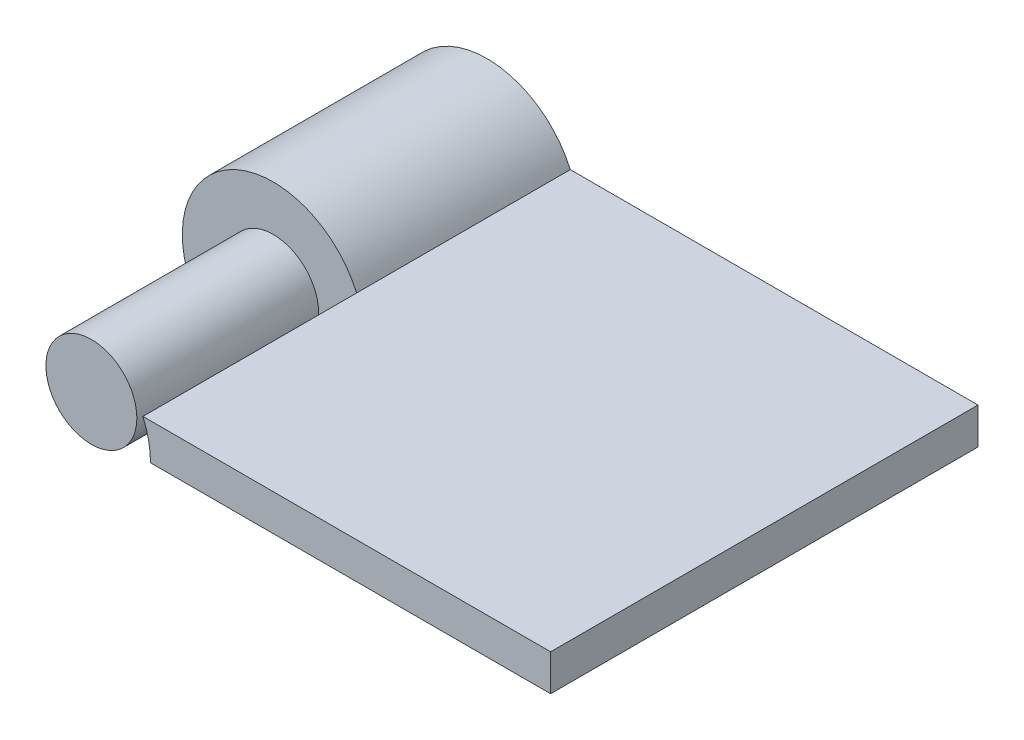
ISO-10303-21;
HEADER;
FILE_DESCRIPTION(('STEP AP214'),'2;1');
FILE_NAME('part.step','',(''),(''),'','','');
FILE_SCHEMA(('AUTOMOTIVE_DESIGN { 1 0 10303 214 1 1 1 1 }'));
ENDSEC;
DATA;
#1=APPLICATION_CONTEXT('core data for automotive mechanical design processes');
#2=APPLICATION_PROTOCOL_DEFINITION('international standard','automotive_design',2000,#1);
#3=PRODUCT_CONTEXT('',#1,'mechanical');
#4=PRODUCT('Part','Part','',(#3));
#5=PRODUCT_RELATED_PRODUCT_CATEGORY('part','',(#4));
#6=PRODUCT_DEFINITION_FORMATION('','',#4);
#7=PRODUCT_DEFINITION_CONTEXT('part definition',#1,'design');
#8=PRODUCT_DEFINITION('design','',#6,#7);
#9=PRODUCT_DEFINITION_SHAPE('','',#8);
#10=(LENGTH_UNIT() NAMED_UNIT(*) SI_UNIT(.MILLI.,.METRE.));
#11=(NAMED_UNIT(*) PLANE_ANGLE_UNIT() SI_UNIT($,.RADIAN.));
#12=(NAMED_UNIT(*) SI_UNIT($,.STERADIAN.) SOLID_ANGLE_UNIT());
#13=UNCERTAINTY_MEASURE_WITH_UNIT(LENGTH_MEASURE(1.E-05),#10,'distance_accuracy_value','');
#14=(GEOMETRIC_REPRESENTATION_CONTEXT(3) GLOBAL_UNCERTAINTY_ASSIGNED_CONTEXT((#13)) GLOBAL_UNIT_ASSIGNED_CONTEXT((#10,
#11,#12)) REPRESENTATION_CONTEXT('',''));
#15=CARTESIAN_POINT('',(0.,0.,0.));
#16=DIRECTION('',(0.,0.,1.));
#17=DIRECTION('',(1.,0.,0.));
#18=AXIS2_PLACEMENT_3D('',#15,#16,#17);
#19=CARTESIAN_POINT('',(0.,0.,23.5));
#20=DIRECTION('',(0.,0.,-1.));
#21=DIRECTION('',(-1.,0.,0.));
#22=AXIS2_PLACEMENT_3D('',#19,#20,#21);
#23=CYLINDRICAL_SURFACE('',#22,10.);
#24=DIRECTION('',(0.,0.,-1.));
#25=VECTOR('',#24,1.);
#26=CARTESIAN_POINT('',(10.,0.,47.));
#27=LINE('',#26,#25);
#28=CARTESIAN_POINT('',(10.,0.,23.5));
#29=VERTEX_POINT('',#28);
#30=CARTESIAN_POINT('',(10.,0.,0.));
#31=VERTEX_POINT('',#30);
#32=EDGE_CURVE('E60',#29,#31,#27,.T.);
#33=ORIENTED_EDGE('',*,*,#32,.F.);
#34=CARTESIAN_POINT('',(0.,0.,23.5));
#35=DIRECTION('',(0.,0.,1.));
#36=DIRECTION('',(1.,0.,0.));
#37=AXIS2_PLACEMENT_3D('',#34,#35,#36);
#38=CIRCLE('',#37,10.);
#39=CARTESIAN_POINT('',(9.16515138991168,4.,23.5));
#40=VERTEX_POINT('',#39);
#41=EDGE_CURVE('E55',#40,#29,#38,.T.);
#42=ORIENTED_EDGE('',*,*,#41,.F.);
#43=DIRECTION('',(0.,0.,-1.));
#44=VECTOR('',#43,1.);
#45=CARTESIAN_POINT('',(9.16515138991168,4.,47.));
#46=LINE('',#45,#44);
#47=CARTESIAN_POINT('',(9.16515138991168,4.,0.));
#48=VERTEX_POINT('',#47);
#49=EDGE_CURVE('E117',#40,#48,#46,.T.);
#50=ORIENTED_EDGE('',*,*,#49,.T.);
#51=CARTESIAN_POINT('',(0.,0.,0.));
#52=DIRECTION('',(0.,0.,1.));
#53=DIRECTION('',(1.,0.,0.));
#54=AXIS2_PLACEMENT_3D('',#51,#52,#53);
#55=CIRCLE('',#54,10.);
#56=EDGE_CURVE('E42',#48,#31,#55,.T.);
#57=ORIENTED_EDGE('',*,*,#56,.T.);
#58=EDGE_LOOP('',(#33,#42,#50,#57));
#59=FACE_BOUND('',#58,.T.);
#60=ADVANCED_FACE('F39',(#59),#23,.T.);
#61=CARTESIAN_POINT('',(0.,0.,23.5));
#62=DIRECTION('',(0.,0.,1.));
#63=DIRECTION('',(1.,0.,0.));
#64=AXIS2_PLACEMENT_3D('',#61,#62,#63);
#65=PLANE('',#64);
#66=CARTESIAN_POINT('',(0.,0.,23.5));
#67=DIRECTION('',(0.,0.,1.));
#68=DIRECTION('',(1.,0.,0.));
#69=AXIS2_PLACEMENT_3D('',#66,#67,#68);
#70=CIRCLE('',#69,5.);
#71=CARTESIAN_POINT('',(5.,0.,23.5));
#72=VERTEX_POINT('',#71);
#73=EDGE_CURVE('E11',#72,#72,#70,.T.);
#74=ORIENTED_EDGE('',*,*,#73,.F.);
#75=EDGE_LOOP('',(#74));
#76=FACE_BOUND('',#75,.T.);
#77=EDGE_CURVE('E47',#29,#40,#38,.T.);
#78=ORIENTED_EDGE('',*,*,#77,.T.);
#79=ORIENTED_EDGE('',*,*,#41,.T.);
#80=EDGE_LOOP('',(#78,#79));
#81=FACE_BOUND('',#80,.T.);
#82=ADVANCED_FACE('F149',(#76,#81),#65,.T.);
#83=CARTESIAN_POINT('',(0.,0.,0.));
#84=DIRECTION('',(0.,0.,1.));
#85=DIRECTION('',(1.,0.,0.));
#86=AXIS2_PLACEMENT_3D('',#83,#84,#85);
#87=PLANE('',#86);
#88=ORIENTED_EDGE('',*,*,#56,.F.);
#89=DIRECTION('',(1.,0.,0.));
#90=VECTOR('',#89,1.);
#91=CARTESIAN_POINT('',(0.,4.,0.));
#92=LINE('',#91,#90);
#93=CARTESIAN_POINT('',(54.,4.,0.));
#94=VERTEX_POINT('',#93);
#95=EDGE_CURVE('E109',#48,#94,#92,.T.);
#96=ORIENTED_EDGE('',*,*,#95,.T.);
#97=DIRECTION('',(0.,1.,0.));
#98=VECTOR('',#97,1.);
#99=CARTESIAN_POINT('',(54.,0.,0.));
#100=LINE('',#99,#98);
#101=CARTESIAN_POINT('',(54.,0.,0.));
#102=VERTEX_POINT('',#101);
#103=EDGE_CURVE('E112',#102,#94,#100,.T.);
#104=ORIENTED_EDGE('',*,*,#103,.F.);
#105=DIRECTION('',(1.,0.,0.));
#106=VECTOR('',#105,1.);
#107=CARTESIAN_POINT('',(0.,0.,0.));
#108=LINE('',#107,#106);
#109=EDGE_CURVE('E118',#31,#102,#108,.T.);
#110=ORIENTED_EDGE('',*,*,#109,.F.);
#111=EDGE_LOOP('',(#88,#96,#104,#110));
#112=FACE_BOUND('',#111,.T.);
#113=ADVANCED_FACE('F134',(#112),#87,.F.);
#114=CARTESIAN_POINT('',(0.,0.,43.5));
#115=DIRECTION('',(0.,0.,-1.));
#116=DIRECTION('',(-1.,0.,0.));
#117=AXIS2_PLACEMENT_3D('',#114,#115,#116);
#118=CYLINDRICAL_SURFACE('',#117,5.);
#119=CARTESIAN_POINT('',(0.,0.,43.5));
#120=DIRECTION('',(0.,0.,1.));
#121=DIRECTION('',(1.,0.,0.));
#122=AXIS2_PLACEMENT_3D('',#119,#120,#121);
#123=CIRCLE('',#122,5.);
#124=CARTESIAN_POINT('',(5.,0.,43.5));
#125=VERTEX_POINT('',#124);
#126=EDGE_CURVE('E95',#125,#125,#123,.T.);
#127=ORIENTED_EDGE('',*,*,#126,.F.);
#128=EDGE_LOOP('',(#127));
#129=FACE_BOUND('',#128,.T.);
#130=ORIENTED_EDGE('',*,*,#73,.T.);
#131=EDGE_LOOP('',(#130));
#132=FACE_BOUND('',#131,.T.);
#133=ADVANCED_FACE('F158',(#129,#132),#118,.T.);
#134=CARTESIAN_POINT('',(0.,0.,43.5));
#135=DIRECTION('',(0.,0.,1.));
#136=DIRECTION('',(1.,0.,0.));
#137=AXIS2_PLACEMENT_3D('',#134,#135,#136);
#138=PLANE('',#137);
#139=ORIENTED_EDGE('',*,*,#126,.T.);
#140=EDGE_LOOP('',(#139));
#141=FACE_BOUND('',#140,.T.);
#142=ADVANCED_FACE('F163',(#141),#138,.T.);
#143=CARTESIAN_POINT('',(0.,0.,47.));
#144=DIRECTION('',(0.,0.,-1.));
#145=DIRECTION('',(-1.,0.,0.));
#146=AXIS2_PLACEMENT_3D('',#143,#144,#145);
#147=CYLINDRICAL_SURFACE('',#146,10.);
#148=CARTESIAN_POINT('',(9.16515138991168,4.,47.));
#149=VERTEX_POINT('',#148);
#150=EDGE_CURVE('E122',#149,#40,#46,.T.);
#151=ORIENTED_EDGE('',*,*,#150,.T.);
#152=ORIENTED_EDGE('',*,*,#77,.F.);
#153=CARTESIAN_POINT('',(10.,0.,47.));
#154=VERTEX_POINT('',#153);
#155=EDGE_CURVE('E87',#154,#29,#27,.T.);
#156=ORIENTED_EDGE('',*,*,#155,.F.);
#157=CARTESIAN_POINT('',(0.,0.,47.));
#158=DIRECTION('',(0.,0.,1.));
#159=DIRECTION('',(1.,0.,0.));
#160=AXIS2_PLACEMENT_3D('',#157,#158,#159);
#161=CIRCLE('',#160,10.);
#162=EDGE_CURVE('E92',#154,#149,#161,.T.);
#163=ORIENTED_EDGE('',*,*,#162,.T.);
#164=EDGE_LOOP('',(#151,#152,#156,#163));
#165=FACE_BOUND('',#164,.T.);
#166=ADVANCED_FACE('F90',(#165),#147,.F.);
#167=CARTESIAN_POINT('',(0.,0.,47.));
#168=DIRECTION('',(0.,1.,0.));
#169=DIRECTION('',(-1.,0.,0.));
#170=AXIS2_PLACEMENT_3D('',#167,#168,#169);
#171=PLANE('',#170);
#172=ORIENTED_EDGE('',*,*,#109,.T.);
#173=DIRECTION('',(0.,0.,-1.));
#174=VECTOR('',#173,1.);
#175=CARTESIAN_POINT('',(54.,0.,47.));
#176=LINE('',#175,#174);
#177=CARTESIAN_POINT('',(54.,0.,47.));
#178=VERTEX_POINT('',#177);
#179=EDGE_CURVE('E101',#178,#102,#176,.T.);
#180=ORIENTED_EDGE('',*,*,#179,.F.);
#181=DIRECTION('',(1.,0.,0.));
#182=VECTOR('',#181,1.);
#183=CARTESIAN_POINT('',(0.,0.,47.));
#184=LINE('',#183,#182);
#185=EDGE_CURVE('E98',#154,#178,#184,.T.);
#186=ORIENTED_EDGE('',*,*,#185,.F.);
#187=ORIENTED_EDGE('',*,*,#155,.T.);
#188=ORIENTED_EDGE('',*,*,#32,.T.);
#189=EDGE_LOOP('',(#172,#180,#186,#187,#188));
#190=FACE_BOUND('',#189,.T.);
#191=ADVANCED_FACE('F99',(#190),#171,.F.);
#192=CARTESIAN_POINT('',(54.,0.,47.));
#193=DIRECTION('',(-1.,0.,0.));
#194=DIRECTION('',(0.,0.,1.));
#195=AXIS2_PLACEMENT_3D('',#192,#193,#194);
#196=PLANE('',#195);
#197=ORIENTED_EDGE('',*,*,#103,.T.);
#198=DIRECTION('',(0.,0.,-1.));
#199=VECTOR('',#198,1.);
#200=CARTESIAN_POINT('',(54.,4.,47.));
#201=LINE('',#200,#199);
#202=CARTESIAN_POINT('',(54.,4.,47.));
#203=VERTEX_POINT('',#202);
#204=EDGE_CURVE('E124',#203,#94,#201,.T.);
#205=ORIENTED_EDGE('',*,*,#204,.F.);
#206=DIRECTION('',(0.,1.,0.));
#207=VECTOR('',#206,1.);
#208=CARTESIAN_POINT('',(54.,0.,47.));
#209=LINE('',#208,#207);
#210=EDGE_CURVE('E104',#178,#203,#209,.T.);
#211=ORIENTED_EDGE('',*,*,#210,.F.);
#212=ORIENTED_EDGE('',*,*,#179,.T.);
#213=EDGE_LOOP('',(#197,#205,#211,#212));
#214=FACE_BOUND('',#213,.T.);
#215=ADVANCED_FACE('F137',(#214),#196,.F.);
#216=CARTESIAN_POINT('',(0.,4.,47.));
#217=DIRECTION('',(0.,1.,0.));
#218=DIRECTION('',(-1.,0.,0.));
#219=AXIS2_PLACEMENT_3D('',#216,#217,#218);
#220=PLANE('',#219);
#221=ORIENTED_EDGE('',*,*,#95,.F.);
#222=ORIENTED_EDGE('',*,*,#49,.F.);
#223=ORIENTED_EDGE('',*,*,#150,.F.);
#224=DIRECTION('',(1.,0.,0.));
#225=VECTOR('',#224,1.);
#226=CARTESIAN_POINT('',(0.,4.,47.));
#227=LINE('',#226,#225);
#228=EDGE_CURVE('E108',#149,#203,#227,.T.);
#229=ORIENTED_EDGE('',*,*,#228,.T.);
#230=ORIENTED_EDGE('',*,*,#204,.T.);
#231=EDGE_LOOP('',(#221,#222,#223,#229,#230));
#232=FACE_BOUND('',#231,.T.);
#233=ADVANCED_FACE('F139',(#232),#220,.T.);
#234=CARTESIAN_POINT('',(0.,0.,47.));
#235=DIRECTION('',(0.,0.,1.));
#236=DIRECTION('',(1.,0.,0.));
#237=AXIS2_PLACEMENT_3D('',#234,#235,#236);
#238=PLANE('',#237);
#239=ORIENTED_EDGE('',*,*,#162,.F.);
#240=ORIENTED_EDGE('',*,*,#185,.T.);
#241=ORIENTED_EDGE('',*,*,#210,.T.);
#242=ORIENTED_EDGE('',*,*,#228,.F.);
#243=EDGE_LOOP('',(#239,#240,#241,#242));
#244=FACE_BOUND('',#243,.T.);
#245=ADVANCED_FACE('F106',(#244),#238,.T.);
#246=CLOSED_SHELL('',(#60,#82,#113,#133,#142,#166,#191,#215,#233,#245));
#247=MANIFOLD_SOLID_BREP('B2',#246);
#248=ADVANCED_BREP_SHAPE_REPRESENTATION('',(#18,#247),#14);
#249=SHAPE_DEFINITION_REPRESENTATION(#9,#248);
ENDSEC;
END-ISO-10303-21;
